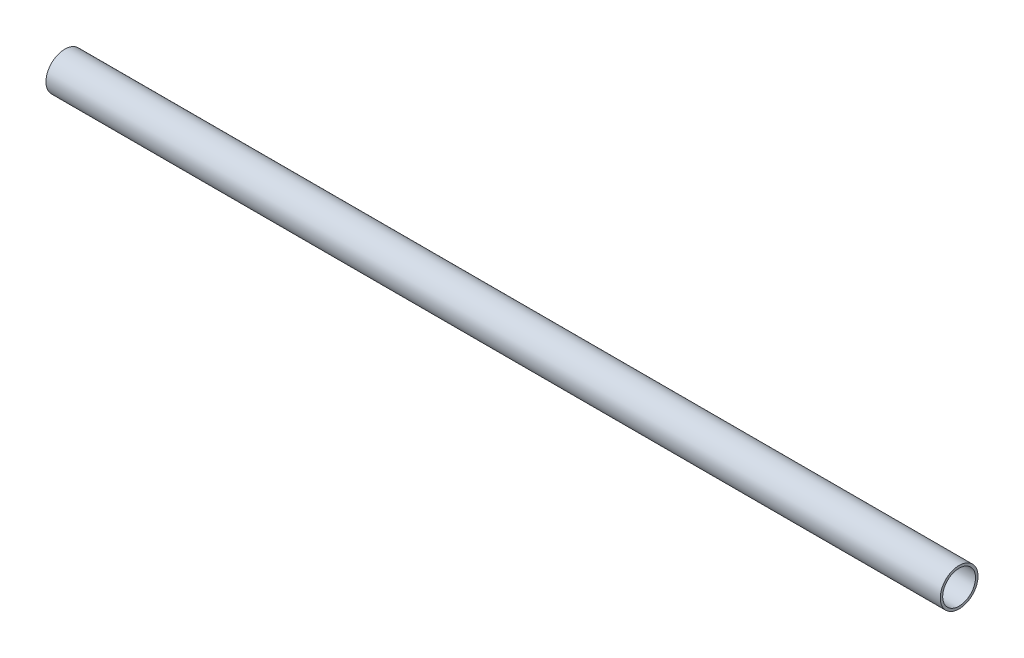
ISO-10303-21;
HEADER;
FILE_DESCRIPTION(('STEP AP214'),'2;1');
FILE_NAME('part.step','',(''),(''),'','','');
FILE_SCHEMA(('AUTOMOTIVE_DESIGN { 1 0 10303 214 1 1 1 1 }'));
ENDSEC;
DATA;
#1=APPLICATION_CONTEXT('core data for automotive mechanical design processes');
#2=APPLICATION_PROTOCOL_DEFINITION('international standard','automotive_design',2000,#1);
#3=PRODUCT_CONTEXT('',#1,'mechanical');
#4=PRODUCT('Part','Part','',(#3));
#5=PRODUCT_RELATED_PRODUCT_CATEGORY('part','',(#4));
#6=PRODUCT_DEFINITION_FORMATION('','',#4);
#7=PRODUCT_DEFINITION_CONTEXT('part definition',#1,'design');
#8=PRODUCT_DEFINITION('design','',#6,#7);
#9=PRODUCT_DEFINITION_SHAPE('','',#8);
#10=(LENGTH_UNIT() NAMED_UNIT(*) SI_UNIT(.MILLI.,.METRE.));
#11=(NAMED_UNIT(*) PLANE_ANGLE_UNIT() SI_UNIT($,.RADIAN.));
#12=(NAMED_UNIT(*) SI_UNIT($,.STERADIAN.) SOLID_ANGLE_UNIT());
#13=UNCERTAINTY_MEASURE_WITH_UNIT(LENGTH_MEASURE(1.E-05),#10,'distance_accuracy_value','');
#14=(GEOMETRIC_REPRESENTATION_CONTEXT(3) GLOBAL_UNCERTAINTY_ASSIGNED_CONTEXT((#13)) GLOBAL_UNIT_ASSIGNED_CONTEXT((#10,
#11,#12)) REPRESENTATION_CONTEXT('',''));
#15=CARTESIAN_POINT('',(0.,0.,0.));
#16=DIRECTION('',(0.,0.,1.));
#17=DIRECTION('',(1.,0.,0.));
#18=AXIS2_PLACEMENT_3D('',#15,#16,#17);
#19=CARTESIAN_POINT('',(0.,0.,0.));
#20=DIRECTION('',(1.,0.,0.));
#21=DIRECTION('',(0.,0.,-1.));
#22=AXIS2_PLACEMENT_3D('',#19,#20,#21);
#23=CYLINDRICAL_SURFACE('',#22,9.25);
#24=CARTESIAN_POINT('',(0.,0.,0.));
#25=DIRECTION('',(1.,0.,0.));
#26=DIRECTION('',(0.,0.,-1.));
#27=AXIS2_PLACEMENT_3D('',#24,#25,#26);
#28=CIRCLE('',#27,9.25);
#29=CARTESIAN_POINT('',(0.,0.,-9.25));
#30=VERTEX_POINT('',#29);
#31=EDGE_CURVE('E27',#30,#30,#28,.T.);
#32=ORIENTED_EDGE('',*,*,#31,.F.);
#33=EDGE_LOOP('',(#32));
#34=FACE_BOUND('',#33,.T.);
#35=CARTESIAN_POINT('',(504.2,0.,0.));
#36=DIRECTION('',(1.,0.,0.));
#37=DIRECTION('',(0.,0.,-1.));
#38=AXIS2_PLACEMENT_3D('',#35,#36,#37);
#39=CIRCLE('',#38,9.25);
#40=CARTESIAN_POINT('',(504.2,0.,-9.25));
#41=VERTEX_POINT('',#40);
#42=EDGE_CURVE('E18',#41,#41,#39,.T.);
#43=ORIENTED_EDGE('',*,*,#42,.T.);
#44=EDGE_LOOP('',(#43));
#45=FACE_BOUND('',#44,.T.);
#46=ADVANCED_FACE('F15',(#34,#45),#23,.F.);
#47=CARTESIAN_POINT('',(504.2,0.,0.));
#48=DIRECTION('',(-1.,0.,0.));
#49=DIRECTION('',(0.,0.,1.));
#50=AXIS2_PLACEMENT_3D('',#47,#48,#49);
#51=PLANE('',#50);
#52=ORIENTED_EDGE('',*,*,#42,.F.);
#53=EDGE_LOOP('',(#52));
#54=FACE_BOUND('',#53,.T.);
#55=CARTESIAN_POINT('',(504.2,0.,0.));
#56=DIRECTION('',(1.,0.,0.));
#57=DIRECTION('',(0.,0.,-1.));
#58=AXIS2_PLACEMENT_3D('',#55,#56,#57);
#59=CIRCLE('',#58,10.65);
#60=CARTESIAN_POINT('',(504.2,0.,-10.65));
#61=VERTEX_POINT('',#60);
#62=EDGE_CURVE('E22',#61,#61,#59,.F.);
#63=ORIENTED_EDGE('',*,*,#62,.F.);
#64=EDGE_LOOP('',(#63));
#65=FACE_BOUND('',#64,.T.);
#66=ADVANCED_FACE('F36',(#54,#65),#51,.F.);
#67=CARTESIAN_POINT('',(0.,0.,0.));
#68=DIRECTION('',(-1.,0.,0.));
#69=DIRECTION('',(0.,0.,1.));
#70=AXIS2_PLACEMENT_3D('',#67,#68,#69);
#71=PLANE('',#70);
#72=ORIENTED_EDGE('',*,*,#31,.T.);
#73=EDGE_LOOP('',(#72));
#74=FACE_BOUND('',#73,.T.);
#75=CARTESIAN_POINT('',(0.,0.,0.));
#76=DIRECTION('',(1.,0.,0.));
#77=DIRECTION('',(0.,0.,-1.));
#78=AXIS2_PLACEMENT_3D('',#75,#76,#77);
#79=CIRCLE('',#78,10.65);
#80=CARTESIAN_POINT('',(0.,0.,-10.65));
#81=VERTEX_POINT('',#80);
#82=EDGE_CURVE('E10',#81,#81,#79,.T.);
#83=ORIENTED_EDGE('',*,*,#82,.F.);
#84=EDGE_LOOP('',(#83));
#85=FACE_BOUND('',#84,.T.);
#86=ADVANCED_FACE('F39',(#74,#85),#71,.T.);
#87=CARTESIAN_POINT('',(0.,0.,0.));
#88=DIRECTION('',(1.,0.,0.));
#89=DIRECTION('',(0.,0.,-1.));
#90=AXIS2_PLACEMENT_3D('',#87,#88,#89);
#91=CYLINDRICAL_SURFACE('',#90,10.65);
#92=ORIENTED_EDGE('',*,*,#82,.T.);
#93=EDGE_LOOP('',(#92));
#94=FACE_BOUND('',#93,.T.);
#95=ORIENTED_EDGE('',*,*,#62,.T.);
#96=EDGE_LOOP('',(#95));
#97=FACE_BOUND('',#96,.T.);
#98=ADVANCED_FACE('F42',(#94,#97),#91,.T.);
#99=CLOSED_SHELL('',(#46,#66,#86,#98));
#100=MANIFOLD_SOLID_BREP('B1',#99);
#101=ADVANCED_BREP_SHAPE_REPRESENTATION('',(#18,#100),#14);
#102=SHAPE_DEFINITION_REPRESENTATION(#9,#101);
ENDSEC;
END-ISO-10303-21;
